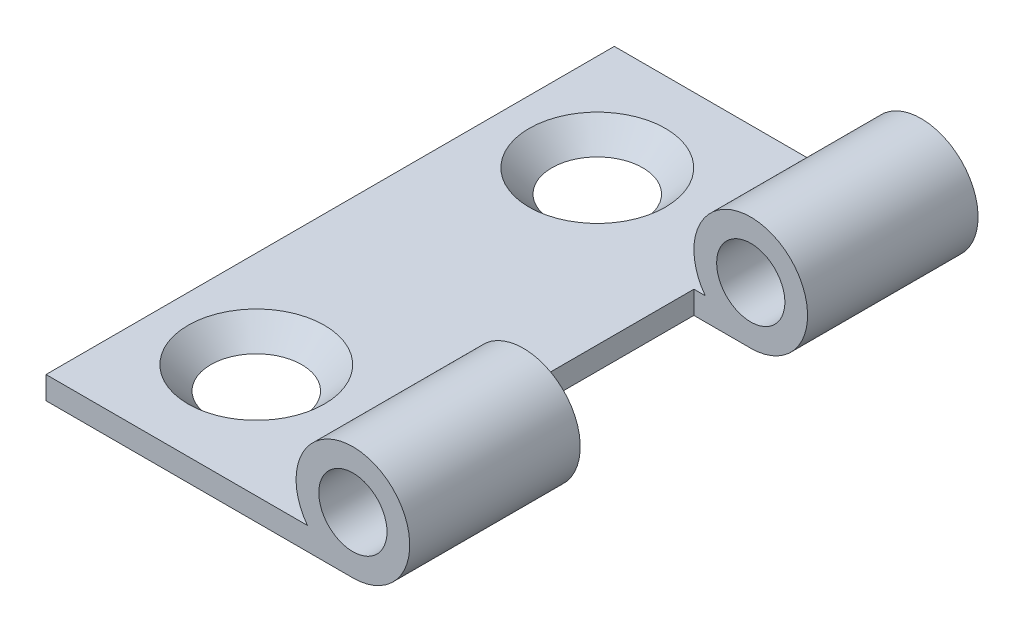
ISO-10303-21;
HEADER;
FILE_DESCRIPTION(('STEP AP214'),'2;1');
FILE_NAME('part.step','',(''),(''),'','','');
FILE_SCHEMA(('AUTOMOTIVE_DESIGN { 1 0 10303 214 1 1 1 1 }'));
ENDSEC;
DATA;
#1=APPLICATION_CONTEXT('core data for automotive mechanical design processes');
#2=APPLICATION_PROTOCOL_DEFINITION('international standard','automotive_design',2000,#1);
#3=PRODUCT_CONTEXT('',#1,'mechanical');
#4=PRODUCT('Part','Part','',(#3));
#5=PRODUCT_RELATED_PRODUCT_CATEGORY('part','',(#4));
#6=PRODUCT_DEFINITION_FORMATION('','',#4);
#7=PRODUCT_DEFINITION_CONTEXT('part definition',#1,'design');
#8=PRODUCT_DEFINITION('design','',#6,#7);
#9=PRODUCT_DEFINITION_SHAPE('','',#8);
#10=(LENGTH_UNIT() NAMED_UNIT(*) SI_UNIT(.MILLI.,.METRE.));
#11=(NAMED_UNIT(*) PLANE_ANGLE_UNIT() SI_UNIT($,.RADIAN.));
#12=(NAMED_UNIT(*) SI_UNIT($,.STERADIAN.) SOLID_ANGLE_UNIT());
#13=UNCERTAINTY_MEASURE_WITH_UNIT(LENGTH_MEASURE(1.E-05),#10,'distance_accuracy_value','');
#14=(GEOMETRIC_REPRESENTATION_CONTEXT(3) GLOBAL_UNCERTAINTY_ASSIGNED_CONTEXT((#13)) GLOBAL_UNIT_ASSIGNED_CONTEXT((#10,
#11,#12)) REPRESENTATION_CONTEXT('',''));
#15=CARTESIAN_POINT('',(0.,0.,0.));
#16=DIRECTION('',(0.,0.,1.));
#17=DIRECTION('',(1.,0.,0.));
#18=AXIS2_PLACEMENT_3D('',#15,#16,#17);
#19=CARTESIAN_POINT('',(0.,0.,25.));
#20=DIRECTION('',(0.,0.,-1.));
#21=DIRECTION('',(-1.,0.,0.));
#22=AXIS2_PLACEMENT_3D('',#19,#20,#21);
#23=CYLINDRICAL_SURFACE('',#22,2.5);
#24=CARTESIAN_POINT('',(0.,0.,7.5));
#25=DIRECTION('',(0.,0.,-1.));
#26=DIRECTION('',(-1.,0.,0.));
#27=AXIS2_PLACEMENT_3D('',#24,#25,#26);
#28=CIRCLE('',#27,2.5);
#29=CARTESIAN_POINT('',(-2.,-1.5,7.5));
#30=VERTEX_POINT('',#29);
#31=CARTESIAN_POINT('',(0.,-2.5,7.5));
#32=VERTEX_POINT('',#31);
#33=EDGE_CURVE('E119',#30,#32,#28,.T.);
#34=ORIENTED_EDGE('',*,*,#33,.T.);
#35=DIRECTION('',(0.,0.,-1.));
#36=VECTOR('',#35,1.);
#37=CARTESIAN_POINT('',(0.,-2.5,25.));
#38=LINE('',#37,#36);
#39=CARTESIAN_POINT('',(0.,-2.5,0.));
#40=VERTEX_POINT('',#39);
#41=EDGE_CURVE('E89',#32,#40,#38,.T.);
#42=ORIENTED_EDGE('',*,*,#41,.T.);
#43=CARTESIAN_POINT('',(0.,0.,0.));
#44=DIRECTION('',(0.,0.,1.));
#45=DIRECTION('',(1.,0.,0.));
#46=AXIS2_PLACEMENT_3D('',#43,#44,#45);
#47=CIRCLE('',#46,2.5);
#48=CARTESIAN_POINT('',(-2.,-1.5,0.));
#49=VERTEX_POINT('',#48);
#50=EDGE_CURVE('E155',#40,#49,#47,.T.);
#51=ORIENTED_EDGE('',*,*,#50,.T.);
#52=DIRECTION('',(0.,0.,-1.));
#53=VECTOR('',#52,1.);
#54=CARTESIAN_POINT('',(-2.,-1.5,25.));
#55=LINE('',#54,#53);
#56=EDGE_CURVE('E193',#30,#49,#55,.T.);
#57=ORIENTED_EDGE('',*,*,#56,.F.);
#58=EDGE_LOOP('',(#34,#42,#51,#57));
#59=FACE_BOUND('',#58,.T.);
#60=ADVANCED_FACE('F41',(#59),#23,.T.);
#61=CARTESIAN_POINT('',(0.,0.,25.));
#62=DIRECTION('',(0.,0.,-1.));
#63=DIRECTION('',(-1.,0.,0.));
#64=AXIS2_PLACEMENT_3D('',#61,#62,#63);
#65=CYLINDRICAL_SURFACE('',#64,1.5);
#66=CARTESIAN_POINT('',(0.,0.,17.5));
#67=DIRECTION('',(0.,0.,1.));
#68=DIRECTION('',(1.,0.,0.));
#69=AXIS2_PLACEMENT_3D('',#66,#67,#68);
#70=CIRCLE('',#69,1.5);
#71=CARTESIAN_POINT('',(1.5,0.,17.5));
#72=VERTEX_POINT('',#71);
#73=EDGE_CURVE('E123',#72,#72,#70,.T.);
#74=ORIENTED_EDGE('',*,*,#73,.F.);
#75=EDGE_LOOP('',(#74));
#76=FACE_BOUND('',#75,.T.);
#77=CARTESIAN_POINT('',(0.,0.,25.));
#78=DIRECTION('',(0.,0.,1.));
#79=DIRECTION('',(1.,0.,0.));
#80=AXIS2_PLACEMENT_3D('',#77,#78,#79);
#81=CIRCLE('',#80,1.5);
#82=CARTESIAN_POINT('',(1.5,0.,25.));
#83=VERTEX_POINT('',#82);
#84=EDGE_CURVE('E151',#83,#83,#81,.T.);
#85=ORIENTED_EDGE('',*,*,#84,.T.);
#86=EDGE_LOOP('',(#85));
#87=FACE_BOUND('',#86,.T.);
#88=ADVANCED_FACE('F224',(#76,#87),#65,.F.);
#89=CARTESIAN_POINT('',(0.,0.,25.));
#90=DIRECTION('',(0.,0.,1.));
#91=DIRECTION('',(1.,0.,0.));
#92=AXIS2_PLACEMENT_3D('',#89,#90,#91);
#93=PLANE('',#92);
#94=CARTESIAN_POINT('',(0.,0.,25.));
#95=DIRECTION('',(0.,0.,1.));
#96=DIRECTION('',(1.,0.,0.));
#97=AXIS2_PLACEMENT_3D('',#94,#95,#96);
#98=CIRCLE('',#97,2.5);
#99=CARTESIAN_POINT('',(0.,-2.5,25.));
#100=VERTEX_POINT('',#99);
#101=CARTESIAN_POINT('',(-2.,-1.5,25.));
#102=VERTEX_POINT('',#101);
#103=EDGE_CURVE('E160',#100,#102,#98,.T.);
#104=ORIENTED_EDGE('',*,*,#103,.T.);
#105=DIRECTION('',(-1.,0.,0.));
#106=VECTOR('',#105,1.);
#107=CARTESIAN_POINT('',(-13.5,-1.5,25.));
#108=LINE('',#107,#106);
#109=CARTESIAN_POINT('',(-13.5,-1.5,25.));
#110=VERTEX_POINT('',#109);
#111=EDGE_CURVE('E97',#102,#110,#108,.T.);
#112=ORIENTED_EDGE('',*,*,#111,.T.);
#113=DIRECTION('',(0.,-1.,0.));
#114=VECTOR('',#113,1.);
#115=CARTESIAN_POINT('',(-13.5,-2.5,25.));
#116=LINE('',#115,#114);
#117=CARTESIAN_POINT('',(-13.5,-2.5,25.));
#118=VERTEX_POINT('',#117);
#119=EDGE_CURVE('E166',#110,#118,#116,.T.);
#120=ORIENTED_EDGE('',*,*,#119,.T.);
#121=DIRECTION('',(1.,0.,0.));
#122=VECTOR('',#121,1.);
#123=CARTESIAN_POINT('',(0.,-2.5,25.));
#124=LINE('',#123,#122);
#125=EDGE_CURVE('E67',#118,#100,#124,.T.);
#126=ORIENTED_EDGE('',*,*,#125,.T.);
#127=EDGE_LOOP('',(#104,#112,#120,#126));
#128=FACE_BOUND('',#127,.T.);
#129=ORIENTED_EDGE('',*,*,#84,.F.);
#130=EDGE_LOOP('',(#129));
#131=FACE_BOUND('',#130,.T.);
#132=ADVANCED_FACE('F230',(#128,#131),#93,.T.);
#133=CARTESIAN_POINT('',(0.,0.,0.));
#134=DIRECTION('',(0.,0.,1.));
#135=DIRECTION('',(1.,0.,0.));
#136=AXIS2_PLACEMENT_3D('',#133,#134,#135);
#137=PLANE('',#136);
#138=ORIENTED_EDGE('',*,*,#50,.F.);
#139=DIRECTION('',(1.,0.,0.));
#140=VECTOR('',#139,1.);
#141=CARTESIAN_POINT('',(0.,-2.5,0.));
#142=LINE('',#141,#140);
#143=CARTESIAN_POINT('',(-13.5,-2.5,0.));
#144=VERTEX_POINT('',#143);
#145=EDGE_CURVE('E163',#144,#40,#142,.T.);
#146=ORIENTED_EDGE('',*,*,#145,.F.);
#147=DIRECTION('',(0.,-1.,0.));
#148=VECTOR('',#147,1.);
#149=CARTESIAN_POINT('',(-13.5,-2.5,0.));
#150=LINE('',#149,#148);
#151=CARTESIAN_POINT('',(-13.5,-1.5,0.));
#152=VERTEX_POINT('',#151);
#153=EDGE_CURVE('E176',#152,#144,#150,.T.);
#154=ORIENTED_EDGE('',*,*,#153,.F.);
#155=DIRECTION('',(-1.,0.,0.));
#156=VECTOR('',#155,1.);
#157=CARTESIAN_POINT('',(-13.5,-1.5,0.));
#158=LINE('',#157,#156);
#159=EDGE_CURVE('E173',#49,#152,#158,.T.);
#160=ORIENTED_EDGE('',*,*,#159,.F.);
#161=EDGE_LOOP('',(#138,#146,#154,#160));
#162=FACE_BOUND('',#161,.T.);
#163=CARTESIAN_POINT('',(0.,0.,0.));
#164=DIRECTION('',(0.,0.,1.));
#165=DIRECTION('',(1.,0.,0.));
#166=AXIS2_PLACEMENT_3D('',#163,#164,#165);
#167=CIRCLE('',#166,1.5);
#168=CARTESIAN_POINT('',(1.5,0.,0.));
#169=VERTEX_POINT('',#168);
#170=EDGE_CURVE('E156',#169,#169,#167,.T.);
#171=ORIENTED_EDGE('',*,*,#170,.T.);
#172=EDGE_LOOP('',(#171));
#173=FACE_BOUND('',#172,.T.);
#174=ADVANCED_FACE('F236',(#162,#173),#137,.F.);
#175=CARTESIAN_POINT('',(0.,-2.5,17.5));
#176=VERTEX_POINT('',#175);
#177=EDGE_CURVE('E181',#100,#176,#38,.T.);
#178=ORIENTED_EDGE('',*,*,#177,.T.);
#179=CARTESIAN_POINT('',(0.,0.,17.5));
#180=DIRECTION('',(0.,0.,1.));
#181=DIRECTION('',(1.,0.,0.));
#182=AXIS2_PLACEMENT_3D('',#179,#180,#181);
#183=CIRCLE('',#182,2.5);
#184=CARTESIAN_POINT('',(-2.,-1.5,17.5));
#185=VERTEX_POINT('',#184);
#186=EDGE_CURVE('E147',#176,#185,#183,.T.);
#187=ORIENTED_EDGE('',*,*,#186,.T.);
#188=EDGE_CURVE('E194',#102,#185,#55,.T.);
#189=ORIENTED_EDGE('',*,*,#188,.F.);
#190=ORIENTED_EDGE('',*,*,#103,.F.);
#191=EDGE_LOOP('',(#178,#187,#189,#190));
#192=FACE_BOUND('',#191,.T.);
#193=ADVANCED_FACE('F226',(#192),#23,.T.);
#194=CARTESIAN_POINT('',(-13.5,-1.5,25.));
#195=DIRECTION('',(0.,-1.,0.));
#196=DIRECTION('',(1.,0.,0.));
#197=AXIS2_PLACEMENT_3D('',#194,#195,#196);
#198=PLANE('',#197);
#199=CARTESIAN_POINT('',(-9.25,-1.5,20.));
#200=DIRECTION('',(0.,-1.,0.));
#201=DIRECTION('',(1.,0.,0.));
#202=AXIS2_PLACEMENT_3D('',#199,#200,#201);
#203=CIRCLE('',#202,3.00000000000001);
#204=CARTESIAN_POINT('',(-6.24999999999999,-1.5,20.));
#205=VERTEX_POINT('',#204);
#206=EDGE_CURVE('E11',#205,#205,#203,.T.);
#207=ORIENTED_EDGE('',*,*,#206,.T.);
#208=EDGE_LOOP('',(#207));
#209=FACE_BOUND('',#208,.T.);
#210=CARTESIAN_POINT('',(-9.25,-1.5,5.));
#211=DIRECTION('',(0.,-1.,0.));
#212=DIRECTION('',(1.,0.,0.));
#213=AXIS2_PLACEMENT_3D('',#210,#211,#212);
#214=CIRCLE('',#213,3.00000000000001);
#215=CARTESIAN_POINT('',(-6.24999999999999,-1.5,5.));
#216=VERTEX_POINT('',#215);
#217=EDGE_CURVE('E51',#216,#216,#214,.T.);
#218=ORIENTED_EDGE('',*,*,#217,.T.);
#219=EDGE_LOOP('',(#218));
#220=FACE_BOUND('',#219,.T.);
#221=ORIENTED_EDGE('',*,*,#188,.T.);
#222=DIRECTION('',(-1.,0.,0.));
#223=VECTOR('',#222,1.);
#224=CARTESIAN_POINT('',(-13.5,-1.5,17.5));
#225=LINE('',#224,#223);
#226=CARTESIAN_POINT('',(-2.5,-1.5,17.5));
#227=VERTEX_POINT('',#226);
#228=EDGE_CURVE('E138',#185,#227,#225,.T.);
#229=ORIENTED_EDGE('',*,*,#228,.T.);
#230=DIRECTION('',(0.,0.,-1.));
#231=VECTOR('',#230,1.);
#232=CARTESIAN_POINT('',(-2.5,-1.5,25.));
#233=LINE('',#232,#231);
#234=CARTESIAN_POINT('',(-2.5,-1.5,7.5));
#235=VERTEX_POINT('',#234);
#236=EDGE_CURVE('E128',#227,#235,#233,.T.);
#237=ORIENTED_EDGE('',*,*,#236,.T.);
#238=DIRECTION('',(1.,0.,0.));
#239=VECTOR('',#238,1.);
#240=CARTESIAN_POINT('',(-13.5,-1.5,7.5));
#241=LINE('',#240,#239);
#242=EDGE_CURVE('E117',#235,#30,#241,.T.);
#243=ORIENTED_EDGE('',*,*,#242,.T.);
#244=ORIENTED_EDGE('',*,*,#56,.T.);
#245=ORIENTED_EDGE('',*,*,#159,.T.);
#246=DIRECTION('',(0.,0.,-1.));
#247=VECTOR('',#246,1.);
#248=CARTESIAN_POINT('',(-13.5,-1.5,25.));
#249=LINE('',#248,#247);
#250=EDGE_CURVE('E189',#110,#152,#249,.T.);
#251=ORIENTED_EDGE('',*,*,#250,.F.);
#252=ORIENTED_EDGE('',*,*,#111,.F.);
#253=EDGE_LOOP('',(#221,#229,#237,#243,#244,#245,#251,#252));
#254=FACE_BOUND('',#253,.T.);
#255=ADVANCED_FACE('F137',(#209,#220,#254),#198,.F.);
#256=CARTESIAN_POINT('',(-13.5,-2.5,25.));
#257=DIRECTION('',(1.,0.,0.));
#258=DIRECTION('',(0.,1.,0.));
#259=AXIS2_PLACEMENT_3D('',#256,#257,#258);
#260=PLANE('',#259);
#261=ORIENTED_EDGE('',*,*,#153,.T.);
#262=DIRECTION('',(0.,0.,-1.));
#263=VECTOR('',#262,1.);
#264=CARTESIAN_POINT('',(-13.5,-2.5,25.));
#265=LINE('',#264,#263);
#266=EDGE_CURVE('E185',#118,#144,#265,.T.);
#267=ORIENTED_EDGE('',*,*,#266,.F.);
#268=ORIENTED_EDGE('',*,*,#119,.F.);
#269=ORIENTED_EDGE('',*,*,#250,.T.);
#270=EDGE_LOOP('',(#261,#267,#268,#269));
#271=FACE_BOUND('',#270,.T.);
#272=ADVANCED_FACE('F242',(#271),#260,.F.);
#273=CARTESIAN_POINT('',(0.,-2.5,25.));
#274=DIRECTION('',(0.,1.,0.));
#275=DIRECTION('',(-1.,0.,0.));
#276=AXIS2_PLACEMENT_3D('',#273,#274,#275);
#277=PLANE('',#276);
#278=CARTESIAN_POINT('',(-9.25,-2.5,5.));
#279=DIRECTION('',(0.,1.,0.));
#280=DIRECTION('',(-1.,0.,0.));
#281=AXIS2_PLACEMENT_3D('',#278,#279,#280);
#282=CIRCLE('',#281,2.);
#283=CARTESIAN_POINT('',(-11.25,-2.5,5.));
#284=VERTEX_POINT('',#283);
#285=EDGE_CURVE('E145',#284,#284,#282,.T.);
#286=ORIENTED_EDGE('',*,*,#285,.T.);
#287=EDGE_LOOP('',(#286));
#288=FACE_BOUND('',#287,.T.);
#289=CARTESIAN_POINT('',(-9.25,-2.5,20.));
#290=DIRECTION('',(0.,1.,0.));
#291=DIRECTION('',(-1.,0.,0.));
#292=AXIS2_PLACEMENT_3D('',#289,#290,#291);
#293=CIRCLE('',#292,2.);
#294=CARTESIAN_POINT('',(-11.25,-2.5,20.));
#295=VERTEX_POINT('',#294);
#296=EDGE_CURVE('E140',#295,#295,#293,.T.);
#297=ORIENTED_EDGE('',*,*,#296,.T.);
#298=EDGE_LOOP('',(#297));
#299=FACE_BOUND('',#298,.T.);
#300=DIRECTION('',(0.,0.,1.));
#301=VECTOR('',#300,1.);
#302=CARTESIAN_POINT('',(-2.5,-2.5,25.));
#303=LINE('',#302,#301);
#304=CARTESIAN_POINT('',(-2.5,-2.5,7.5));
#305=VERTEX_POINT('',#304);
#306=CARTESIAN_POINT('',(-2.5,-2.5,17.5));
#307=VERTEX_POINT('',#306);
#308=EDGE_CURVE('E131',#305,#307,#303,.T.);
#309=ORIENTED_EDGE('',*,*,#308,.T.);
#310=DIRECTION('',(1.,0.,0.));
#311=VECTOR('',#310,1.);
#312=CARTESIAN_POINT('',(0.,-2.5,17.5));
#313=LINE('',#312,#311);
#314=EDGE_CURVE('E205',#307,#176,#313,.T.);
#315=ORIENTED_EDGE('',*,*,#314,.T.);
#316=ORIENTED_EDGE('',*,*,#177,.F.);
#317=ORIENTED_EDGE('',*,*,#125,.F.);
#318=ORIENTED_EDGE('',*,*,#266,.T.);
#319=ORIENTED_EDGE('',*,*,#145,.T.);
#320=ORIENTED_EDGE('',*,*,#41,.F.);
#321=DIRECTION('',(-1.,0.,0.));
#322=VECTOR('',#321,1.);
#323=CARTESIAN_POINT('',(0.,-2.5,7.5));
#324=LINE('',#323,#322);
#325=EDGE_CURVE('E201',#32,#305,#324,.T.);
#326=ORIENTED_EDGE('',*,*,#325,.T.);
#327=EDGE_LOOP('',(#309,#315,#316,#317,#318,#319,#320,#326));
#328=FACE_BOUND('',#327,.T.);
#329=ADVANCED_FACE('F251',(#288,#299,#328),#277,.F.);
#330=CARTESIAN_POINT('',(0.,0.,7.5));
#331=DIRECTION('',(0.,0.,-1.));
#332=DIRECTION('',(-1.,0.,0.));
#333=AXIS2_PLACEMENT_3D('',#330,#331,#332);
#334=CIRCLE('',#333,1.5);
#335=CARTESIAN_POINT('',(-1.5,0.,7.5));
#336=VERTEX_POINT('',#335);
#337=EDGE_CURVE('E197',#336,#336,#334,.T.);
#338=ORIENTED_EDGE('',*,*,#337,.F.);
#339=EDGE_LOOP('',(#338));
#340=FACE_BOUND('',#339,.T.);
#341=ORIENTED_EDGE('',*,*,#170,.F.);
#342=EDGE_LOOP('',(#341));
#343=FACE_BOUND('',#342,.T.);
#344=ADVANCED_FACE('F233',(#340,#343),#65,.F.);
#345=CARTESIAN_POINT('',(-2.5,-9.,17.5));
#346=DIRECTION('',(-1.,0.,0.));
#347=DIRECTION('',(0.,-1.,0.));
#348=AXIS2_PLACEMENT_3D('',#345,#346,#347);
#349=PLANE('',#348);
#350=DIRECTION('',(0.,1.,0.));
#351=VECTOR('',#350,1.);
#352=CARTESIAN_POINT('',(-2.5,-9.,17.5));
#353=LINE('',#352,#351);
#354=EDGE_CURVE('E134',#307,#227,#353,.T.);
#355=ORIENTED_EDGE('',*,*,#354,.F.);
#356=ORIENTED_EDGE('',*,*,#308,.F.);
#357=DIRECTION('',(0.,1.,0.));
#358=VECTOR('',#357,1.);
#359=CARTESIAN_POINT('',(-2.5,-9.,7.5));
#360=LINE('',#359,#358);
#361=EDGE_CURVE('E58',#305,#235,#360,.T.);
#362=ORIENTED_EDGE('',*,*,#361,.T.);
#363=ORIENTED_EDGE('',*,*,#236,.F.);
#364=EDGE_LOOP('',(#355,#356,#362,#363));
#365=FACE_BOUND('',#364,.T.);
#366=ADVANCED_FACE('F127',(#365),#349,.F.);
#367=CARTESIAN_POINT('',(-2.5,-9.,17.5));
#368=DIRECTION('',(0.,0.,1.));
#369=DIRECTION('',(1.,0.,0.));
#370=AXIS2_PLACEMENT_3D('',#367,#368,#369);
#371=PLANE('',#370);
#372=ORIENTED_EDGE('',*,*,#73,.T.);
#373=EDGE_LOOP('',(#372));
#374=FACE_BOUND('',#373,.T.);
#375=ORIENTED_EDGE('',*,*,#186,.F.);
#376=ORIENTED_EDGE('',*,*,#314,.F.);
#377=ORIENTED_EDGE('',*,*,#354,.T.);
#378=ORIENTED_EDGE('',*,*,#228,.F.);
#379=EDGE_LOOP('',(#375,#376,#377,#378));
#380=FACE_BOUND('',#379,.T.);
#381=ADVANCED_FACE('F262',(#374,#380),#371,.F.);
#382=CARTESIAN_POINT('',(-2.5,-9.,7.5));
#383=DIRECTION('',(0.,0.,-1.));
#384=DIRECTION('',(-1.,0.,0.));
#385=AXIS2_PLACEMENT_3D('',#382,#383,#384);
#386=PLANE('',#385);
#387=ORIENTED_EDGE('',*,*,#337,.T.);
#388=EDGE_LOOP('',(#387));
#389=FACE_BOUND('',#388,.T.);
#390=ORIENTED_EDGE('',*,*,#361,.F.);
#391=ORIENTED_EDGE('',*,*,#325,.F.);
#392=ORIENTED_EDGE('',*,*,#33,.F.);
#393=ORIENTED_EDGE('',*,*,#242,.F.);
#394=EDGE_LOOP('',(#390,#391,#392,#393));
#395=FACE_BOUND('',#394,.T.);
#396=ADVANCED_FACE('F118',(#389,#395),#386,.F.);
#397=CARTESIAN_POINT('',(-9.25,-1.5,20.));
#398=DIRECTION('',(0.,1.,0.));
#399=DIRECTION('',(0.,0.,1.));
#400=AXIS2_PLACEMENT_3D('',#397,#398,#399);
#401=CONICAL_SURFACE('',#400,3.00000000000001,0.785398163397443);
#402=ORIENTED_EDGE('',*,*,#296,.F.);
#403=EDGE_LOOP('',(#402));
#404=FACE_BOUND('',#403,.T.);
#405=ORIENTED_EDGE('',*,*,#206,.F.);
#406=EDGE_LOOP('',(#405));
#407=FACE_BOUND('',#406,.T.);
#408=ADVANCED_FACE('F216',(#404,#407),#401,.F.);
#409=CARTESIAN_POINT('',(-9.25,-1.5,5.));
#410=DIRECTION('',(0.,1.,0.));
#411=DIRECTION('',(0.,0.,1.));
#412=AXIS2_PLACEMENT_3D('',#409,#410,#411);
#413=CONICAL_SURFACE('',#412,3.00000000000001,0.785398163397443);
#414=ORIENTED_EDGE('',*,*,#285,.F.);
#415=EDGE_LOOP('',(#414));
#416=FACE_BOUND('',#415,.T.);
#417=ORIENTED_EDGE('',*,*,#217,.F.);
#418=EDGE_LOOP('',(#417));
#419=FACE_BOUND('',#418,.T.);
#420=ADVANCED_FACE('F44',(#416,#419),#413,.F.);
#421=CLOSED_SHELL('',(#60,#88,#132,#174,#193,#255,#272,#329,#344,#366,#381,#396,#408,#420));
#422=MANIFOLD_SOLID_BREP('B2',#421);
#423=ADVANCED_BREP_SHAPE_REPRESENTATION('',(#18,#422),#14);
#424=SHAPE_DEFINITION_REPRESENTATION(#9,#423);
ENDSEC;
END-ISO-10303-21;
